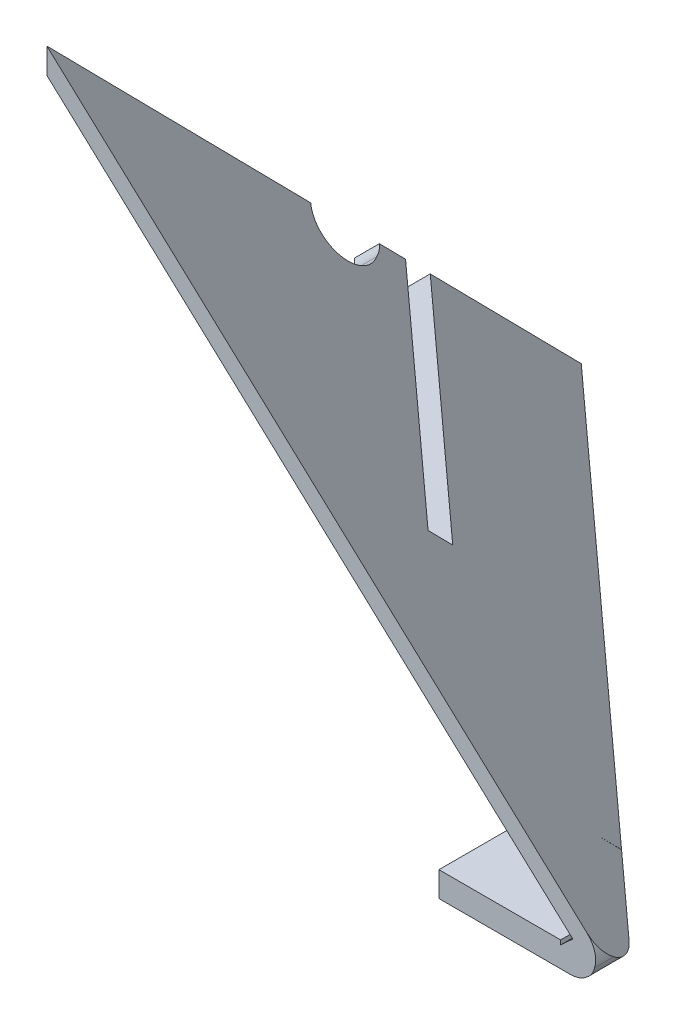
ISO-10303-21;
HEADER;
FILE_DESCRIPTION(('STEP AP214'),'2;1');
FILE_NAME('part.step','',(''),(''),'','','');
FILE_SCHEMA(('AUTOMOTIVE_DESIGN { 1 0 10303 214 1 1 1 1 }'));
ENDSEC;
DATA;
#1=APPLICATION_CONTEXT('core data for automotive mechanical design processes');
#2=APPLICATION_PROTOCOL_DEFINITION('international standard','automotive_design',2000,#1);
#3=PRODUCT_CONTEXT('',#1,'mechanical');
#4=PRODUCT('Part','Part','',(#3));
#5=PRODUCT_RELATED_PRODUCT_CATEGORY('part','',(#4));
#6=PRODUCT_DEFINITION_FORMATION('','',#4);
#7=PRODUCT_DEFINITION_CONTEXT('part definition',#1,'design');
#8=PRODUCT_DEFINITION('design','',#6,#7);
#9=PRODUCT_DEFINITION_SHAPE('','',#8);
#10=(LENGTH_UNIT() NAMED_UNIT(*) SI_UNIT(.MILLI.,.METRE.));
#11=(NAMED_UNIT(*) PLANE_ANGLE_UNIT() SI_UNIT($,.RADIAN.));
#12=(NAMED_UNIT(*) SI_UNIT($,.STERADIAN.) SOLID_ANGLE_UNIT());
#13=UNCERTAINTY_MEASURE_WITH_UNIT(LENGTH_MEASURE(1.E-05),#10,'distance_accuracy_value','');
#14=(GEOMETRIC_REPRESENTATION_CONTEXT(3) GLOBAL_UNCERTAINTY_ASSIGNED_CONTEXT((#13)) GLOBAL_UNIT_ASSIGNED_CONTEXT((#10,
#11,#12)) REPRESENTATION_CONTEXT('',''));
#15=CARTESIAN_POINT('',(0.,0.,0.));
#16=DIRECTION('',(0.,0.,1.));
#17=DIRECTION('',(1.,0.,0.));
#18=AXIS2_PLACEMENT_3D('',#15,#16,#17);
#19=CARTESIAN_POINT('',(-6.31999999999999,22.8853755359338,-18.87));
#20=DIRECTION('',(1.,0.,0.));
#21=DIRECTION('',(0.,-1.,0.));
#22=AXIS2_PLACEMENT_3D('',#19,#20,#21);
#23=PLANE('',#22);
#24=DIRECTION('',(0.,0.,-1.));
#25=VECTOR('',#24,1.);
#26=CARTESIAN_POINT('',(-6.31999999999994,19.8853755359338,-18.87));
#27=LINE('',#26,#25);
#28=CARTESIAN_POINT('',(-6.32000000000005,19.8853755359338,0.));
#29=VERTEX_POINT('',#28);
#30=CARTESIAN_POINT('',(-6.31999999999995,19.8853755359338,-18.352189818249));
#31=VERTEX_POINT('',#30);
#32=EDGE_CURVE('E1924',#29,#31,#27,.T.);
#33=ORIENTED_EDGE('',*,*,#32,.F.);
#34=DIRECTION('',(0.,-1.,0.));
#35=VECTOR('',#34,1.);
#36=CARTESIAN_POINT('',(-6.31999999999999,22.8853755359338,0.));
#37=LINE('',#36,#35);
#38=CARTESIAN_POINT('',(-6.31999999999998,22.8853755359338,0.));
#39=VERTEX_POINT('',#38);
#40=EDGE_CURVE('E1922',#39,#29,#37,.T.);
#41=ORIENTED_EDGE('',*,*,#40,.F.);
#42=DIRECTION('',(0.,0.,1.));
#43=VECTOR('',#42,1.);
#44=CARTESIAN_POINT('',(-6.31999999999999,22.8853755359338,-18.87));
#45=LINE('',#44,#43);
#46=CARTESIAN_POINT('',(-6.31999999999998,22.8853755359338,-15.3957327664914));
#47=VERTEX_POINT('',#46);
#48=EDGE_CURVE('E1883',#47,#39,#45,.T.);
#49=ORIENTED_EDGE('',*,*,#48,.F.);
#50=DIRECTION('',(0.,0.712256848864686,0.701918927829524));
#51=VECTOR('',#50,1.);
#52=CARTESIAN_POINT('',(-6.31999999999867,-47.9024161669893,-85.156088085974));
#53=LINE('',#52,#51);
#54=EDGE_CURVE('E1886',#31,#47,#53,.T.);
#55=ORIENTED_EDGE('',*,*,#54,.F.);
#56=EDGE_LOOP('',(#33,#41,#49,#55));
#57=FACE_BOUND('',#56,.T.);
#58=ADVANCED_FACE('F1643',(#57),#23,.F.);
#59=CARTESIAN_POINT('',(-6.31999999999999,22.8853755359338,-18.87));
#60=DIRECTION('',(0.,1.,0.));
#61=DIRECTION('',(0.,0.,1.));
#62=AXIS2_PLACEMENT_3D('',#59,#60,#61);
#63=PLANE('',#62);
#64=ORIENTED_EDGE('',*,*,#48,.T.);
#65=DIRECTION('',(1.,0.,0.));
#66=VECTOR('',#65,1.);
#67=CARTESIAN_POINT('',(-6.31999999999999,22.8853755359338,0.));
#68=LINE('',#67,#66);
#69=CARTESIAN_POINT('',(8.26000000000006,22.8853755359338,0.));
#70=VERTEX_POINT('',#69);
#71=EDGE_CURVE('E1919',#39,#70,#68,.T.);
#72=ORIENTED_EDGE('',*,*,#71,.T.);
#73=DIRECTION('',(0.,0.,-1.));
#74=VECTOR('',#73,1.);
#75=CARTESIAN_POINT('',(8.26000000000006,22.8853755359338,-12.669921300332));
#76=LINE('',#75,#74);
#77=CARTESIAN_POINT('',(8.26000000000006,22.8853755359338,-2.14828904095654));
#78=VERTEX_POINT('',#77);
#79=EDGE_CURVE('E1974',#70,#78,#76,.T.);
#80=ORIENTED_EDGE('',*,*,#79,.T.);
#81=DIRECTION('',(-0.74011948275692,0.,-0.672475390808935));
#82=VECTOR('',#81,1.);
#83=CARTESIAN_POINT('',(-73.1281881226027,22.8853755359338,-76.0979078391338));
#84=LINE('',#83,#82);
#85=EDGE_CURVE('E1889',#78,#47,#84,.T.);
#86=ORIENTED_EDGE('',*,*,#85,.T.);
#87=EDGE_LOOP('',(#64,#72,#80,#86));
#88=FACE_BOUND('',#87,.T.);
#89=ADVANCED_FACE('F1856',(#88),#63,.T.);
#90=CARTESIAN_POINT('',(-53.32,48.6758787338886,-108.58));
#91=DIRECTION('',(0.,0.,1.));
#92=DIRECTION('',(1.,0.,0.));
#93=AXIS2_PLACEMENT_3D('',#90,#91,#92);
#94=CYLINDRICAL_SURFACE('',#93,4.11454134071264);
#95=DIRECTION('',(0.,0.,1.));
#96=VECTOR('',#95,1.);
#97=CARTESIAN_POINT('',(-53.32,52.7904200746012,-108.58));
#98=LINE('',#97,#96);
#99=CARTESIAN_POINT('',(-53.32,52.7904200746012,-31.629119133167));
#100=VERTEX_POINT('',#99);
#101=CARTESIAN_POINT('',(-53.32,52.7904200746013,-28.629119133167));
#102=VERTEX_POINT('',#101);
#103=EDGE_CURVE('E1910',#100,#102,#98,.T.);
#104=ORIENTED_EDGE('',*,*,#103,.F.);
#105=CARTESIAN_POINT('',(-53.32,48.6758787338886,-35.683940720333));
#106=DIRECTION('',(0.543310732637366,0.589283179245144,-0.597962191496908));
#107=DIRECTION('',(0.405326791463705,0.439623673818327,0.801524308764379));
#108=AXIS2_PLACEMENT_3D('',#105,#106,#107);
#109=ELLIPSE('',#108,6.88093896106124,4.11454134071264);
#110=CARTESIAN_POINT('',(-51.6446774539764,44.9178546771244,-37.8652151596091));
#111=VERTEX_POINT('',#110);
#112=EDGE_CURVE('E1808',#111,#100,#109,.F.);
#113=ORIENTED_EDGE('',*,*,#112,.F.);
#114=DIRECTION('',(0.,0.,1.));
#115=VECTOR('',#114,1.);
#116=CARTESIAN_POINT('',(-51.6446774539764,44.9178546771244,-344.));
#117=LINE('',#116,#115);
#118=CARTESIAN_POINT('',(-51.6446774539764,44.9178546771244,-34.8652151596091));
#119=VERTEX_POINT('',#118);
#120=EDGE_CURVE('E1993',#119,#111,#117,.F.);
#121=ORIENTED_EDGE('',*,*,#120,.F.);
#122=CARTESIAN_POINT('',(-53.32,48.6758787338886,-32.683940720333));
#123=DIRECTION('',(-0.543310732637366,-0.589283179245143,0.597962191496908));
#124=DIRECTION('',(0.405326791463705,0.439623673818327,0.801524308764379));
#125=AXIS2_PLACEMENT_3D('',#122,#123,#124);
#126=ELLIPSE('',#125,6.88093896106124,4.11454134071264);
#127=EDGE_CURVE('E1955',#102,#119,#126,.F.);
#128=ORIENTED_EDGE('',*,*,#127,.F.);
#129=EDGE_LOOP('',(#104,#113,#121,#128));
#130=FACE_BOUND('',#129,.T.);
#131=ADVANCED_FACE('F2019',(#130),#94,.F.);
#132=CARTESIAN_POINT('',(-3.32,19.8853755359338,-175.));
#133=DIRECTION('',(0.,1.,0.));
#134=DIRECTION('',(0.,0.,1.));
#135=AXIS2_PLACEMENT_3D('',#132,#133,#134);
#136=PLANE('',#135);
#137=DIRECTION('',(-0.74011948275692,0.,-0.672475390808935));
#138=VECTOR('',#137,1.);
#139=CARTESIAN_POINT('',(-71.6567235612484,19.8853755359338,-77.7173865664291));
#140=LINE('',#139,#138);
#141=CARTESIAN_POINT('',(-53.32,19.8853755359338,-61.0565694547469));
#142=VERTEX_POINT('',#141);
#143=EDGE_CURVE('E1817',#31,#142,#140,.T.);
#144=ORIENTED_EDGE('',*,*,#143,.T.);
#145=DIRECTION('',(0.,0.,-1.));
#146=VECTOR('',#145,1.);
#147=CARTESIAN_POINT('',(-53.32,19.8853755359338,-175.));
#148=LINE('',#147,#146);
#149=CARTESIAN_POINT('',(-53.32,19.8853755359338,-64.0565694547469));
#150=VERTEX_POINT('',#149);
#151=EDGE_CURVE('E1908',#142,#150,#148,.T.);
#152=ORIENTED_EDGE('',*,*,#151,.T.);
#153=DIRECTION('',(-0.740119482756919,0.,-0.672475390808936));
#154=VECTOR('',#153,1.);
#155=CARTESIAN_POINT('',(-4.81999999999995,19.8853755359338,-19.9892840851692));
#156=LINE('',#155,#154);
#157=CARTESIAN_POINT('',(-0.467862805480057,19.8853755359338,-16.0349155961288));
#158=VERTEX_POINT('',#157);
#159=EDGE_CURVE('E1881',#158,#150,#156,.T.);
#160=ORIENTED_EDGE('',*,*,#159,.F.);
#161=DIRECTION('',(-1.,0.,0.));
#162=VECTOR('',#161,1.);
#163=CARTESIAN_POINT('',(7.68000000000017,19.8853755359338,-16.0349155961288));
#164=LINE('',#163,#162);
#165=CARTESIAN_POINT('',(-0.440104410057803,19.8853755359338,-16.0349155961288));
#166=VERTEX_POINT('',#165);
#167=EDGE_CURVE('E1933',#166,#158,#164,.T.);
#168=ORIENTED_EDGE('',*,*,#167,.F.);
#169=DIRECTION('',(0.,0.,-1.));
#170=VECTOR('',#169,1.);
#171=CARTESIAN_POINT('',(-0.44010441005781,19.8853755359338,-19.7112838552661));
#172=LINE('',#171,#170);
#173=CARTESIAN_POINT('',(-0.440104410057809,19.8853755359338,-16.0096942119541));
#174=VERTEX_POINT('',#173);
#175=EDGE_CURVE('E1926',#174,#166,#172,.T.);
#176=ORIENTED_EDGE('',*,*,#175,.F.);
#177=DIRECTION('',(0.74011948275692,0.,0.672475390808935));
#178=VECTOR('',#177,1.);
#179=CARTESIAN_POINT('',(14.0017304124732,19.8853755359338,-2.88778789474223));
#180=LINE('',#179,#178);
#181=CARTESIAN_POINT('',(9.5003754069526,19.8853755359338,-6.9777362571763));
#182=VERTEX_POINT('',#181);
#183=EDGE_CURVE('E1821',#174,#182,#180,.T.);
#184=ORIENTED_EDGE('',*,*,#183,.T.);
#185=DIRECTION('',(0.,0.,1.));
#186=VECTOR('',#185,1.);
#187=CARTESIAN_POINT('',(9.5003754069526,19.8853755359338,-11.58));
#188=LINE('',#187,#186);
#189=CARTESIAN_POINT('',(9.5003754069526,19.8853755359338,0.));
#190=VERTEX_POINT('',#189);
#191=EDGE_CURVE('E1878',#182,#190,#188,.T.);
#192=ORIENTED_EDGE('',*,*,#191,.T.);
#193=DIRECTION('',(1.,0.,0.));
#194=VECTOR('',#193,1.);
#195=CARTESIAN_POINT('',(-272.32,19.8853755359338,0.));
#196=LINE('',#195,#194);
#197=EDGE_CURVE('E1917',#29,#190,#196,.T.);
#198=ORIENTED_EDGE('',*,*,#197,.F.);
#199=ORIENTED_EDGE('',*,*,#32,.T.);
#200=EDGE_LOOP('',(#144,#152,#160,#168,#176,#184,#192,#198,#199));
#201=FACE_BOUND('',#200,.T.);
#202=ADVANCED_FACE('F1645',(#201),#136,.F.);
#203=CARTESIAN_POINT('',(-82.82,38.2527400163248,-65.58));
#204=DIRECTION('',(0.,1.,0.));
#205=DIRECTION('',(0.,0.,1.));
#206=AXIS2_PLACEMENT_3D('',#203,#204,#205);
#207=PLANE('',#206);
#208=DIRECTION('',(0.,0.,-1.));
#209=VECTOR('',#208,1.);
#210=CARTESIAN_POINT('',(-53.32,38.2527400163248,-65.58));
#211=LINE('',#210,#209);
#212=CARTESIAN_POINT('',(-53.32,38.2527400163247,-42.9557947079959));
#213=VERTEX_POINT('',#212);
#214=CARTESIAN_POINT('',(-53.32,38.2527400163248,-45.9557947079958));
#215=VERTEX_POINT('',#214);
#216=EDGE_CURVE('E1912',#213,#215,#211,.T.);
#217=ORIENTED_EDGE('',*,*,#216,.F.);
#218=DIRECTION('',(-0.74011948275692,0.,-0.672475390808935));
#219=VECTOR('',#218,1.);
#220=CARTESIAN_POINT('',(-80.6656988673726,38.2527400163247,-67.802201215605));
#221=LINE('',#220,#219);
#222=CARTESIAN_POINT('',(-23.82,38.2527400163247,-16.1519819574281));
#223=VERTEX_POINT('',#222);
#224=EDGE_CURVE('E1966',#223,#213,#221,.T.);
#225=ORIENTED_EDGE('',*,*,#224,.F.);
#226=DIRECTION('',(0.,0.,1.));
#227=VECTOR('',#226,1.);
#228=CARTESIAN_POINT('',(-23.82,38.2527400163248,-65.58));
#229=LINE('',#228,#227);
#230=CARTESIAN_POINT('',(-23.82,38.2527400163247,-19.151981957428));
#231=VERTEX_POINT('',#230);
#232=EDGE_CURVE('E1960',#231,#223,#229,.T.);
#233=ORIENTED_EDGE('',*,*,#232,.F.);
#234=DIRECTION('',(0.74011948275692,0.,0.672475390808935));
#235=VECTOR('',#234,1.);
#236=CARTESIAN_POINT('',(4.99275510634899,38.2527400163248,7.02739745608192));
#237=LINE('',#236,#235);
#238=EDGE_CURVE('E1968',#215,#231,#237,.T.);
#239=ORIENTED_EDGE('',*,*,#238,.F.);
#240=EDGE_LOOP('',(#217,#225,#233,#239));
#241=FACE_BOUND('',#240,.T.);
#242=ADVANCED_FACE('F2033',(#241),#207,.T.);
#243=CARTESIAN_POINT('',(-23.82,41.2527400163248,-65.58));
#244=DIRECTION('',(0.,-1.,0.));
#245=DIRECTION('',(1.,0.,0.));
#246=AXIS2_PLACEMENT_3D('',#243,#244,#245);
#247=PLANE('',#246);
#248=DIRECTION('',(0.,0.,1.));
#249=VECTOR('',#248,1.);
#250=CARTESIAN_POINT('',(-53.32,41.2527400163248,-65.58));
#251=LINE('',#250,#249);
#252=CARTESIAN_POINT('',(-53.32,41.2527400163248,-42.9993376562383));
#253=VERTEX_POINT('',#252);
#254=CARTESIAN_POINT('',(-53.32,41.2527400163247,-39.9993376562383));
#255=VERTEX_POINT('',#254);
#256=EDGE_CURVE('E1658',#253,#255,#251,.T.);
#257=ORIENTED_EDGE('',*,*,#256,.F.);
#258=DIRECTION('',(-0.74011948275692,0.,-0.672475390808935));
#259=VECTOR('',#258,1.);
#260=CARTESIAN_POINT('',(3.52129054499471,41.2527400163247,8.64687618337722));
#261=LINE('',#260,#259);
#262=CARTESIAN_POINT('',(-23.82,41.2527400163248,-16.1955249056705));
#263=VERTEX_POINT('',#262);
#264=EDGE_CURVE('E1963',#263,#253,#261,.T.);
#265=ORIENTED_EDGE('',*,*,#264,.F.);
#266=DIRECTION('',(0.,0.,1.));
#267=VECTOR('',#266,1.);
#268=CARTESIAN_POINT('',(-23.82,41.2527400163248,-65.58));
#269=LINE('',#268,#267);
#270=CARTESIAN_POINT('',(-23.82,41.2527400163247,-13.1955249056705));
#271=VERTEX_POINT('',#270);
#272=EDGE_CURVE('E1958',#263,#271,#269,.T.);
#273=ORIENTED_EDGE('',*,*,#272,.T.);
#274=DIRECTION('',(0.74011948275692,0.,0.672475390808935));
#275=VECTOR('',#274,1.);
#276=CARTESIAN_POINT('',(-82.1371634287268,41.2527400163248,-66.1827224883097));
#277=LINE('',#276,#275);
#278=EDGE_CURVE('E1899',#255,#271,#277,.T.);
#279=ORIENTED_EDGE('',*,*,#278,.F.);
#280=EDGE_LOOP('',(#257,#265,#273,#279));
#281=FACE_BOUND('',#280,.T.);
#282=ADVANCED_FACE('F2028',(#281),#247,.T.);
#283=CARTESIAN_POINT('',(-53.32,47.5929050483899,-688.));
#284=DIRECTION('',(0.,0.,1.));
#285=DIRECTION('',(1.,0.,0.));
#286=AXIS2_PLACEMENT_3D('',#283,#284,#285);
#287=CYLINDRICAL_SURFACE('',#286,3.15635868082551);
#288=DIRECTION('',(0.,0.,1.));
#289=VECTOR('',#288,1.);
#290=CARTESIAN_POINT('',(-53.32,44.4365463675644,-688.));
#291=LINE('',#290,#289);
#292=CARTESIAN_POINT('',(-53.32,44.4365463675644,-36.8617420767207));
#293=VERTEX_POINT('',#292);
#294=CARTESIAN_POINT('',(-53.32,44.4365463675644,-39.8617420767207));
#295=VERTEX_POINT('',#294);
#296=EDGE_CURVE('E1904',#293,#295,#291,.F.);
#297=ORIENTED_EDGE('',*,*,#296,.F.);
#298=CARTESIAN_POINT('',(-53.32,47.5929050483899,-33.7511957834531));
#299=DIRECTION('',(-0.543310732637366,-0.589283179245143,0.597962191496908));
#300=DIRECTION('',(0.405326791463705,0.439623673818327,0.801524308764379));
#301=AXIS2_PLACEMENT_3D('',#298,#299,#300);
#302=ELLIPSE('',#301,5.27852550831692,3.15635868082551);
#303=EDGE_CURVE('E1901',#119,#293,#302,.F.);
#304=ORIENTED_EDGE('',*,*,#303,.F.);
#305=ORIENTED_EDGE('',*,*,#120,.T.);
#306=CARTESIAN_POINT('',(-53.32,47.5929050483899,-36.7511957834532));
#307=DIRECTION('',(0.543310732637366,0.589283179245144,-0.597962191496908));
#308=DIRECTION('',(0.405326791463705,0.439623673818327,0.801524308764379));
#309=AXIS2_PLACEMENT_3D('',#306,#307,#308);
#310=ELLIPSE('',#309,5.27852550831692,3.15635868082551);
#311=EDGE_CURVE('E1666',#295,#111,#310,.F.);
#312=ORIENTED_EDGE('',*,*,#311,.F.);
#313=EDGE_LOOP('',(#297,#304,#305,#312));
#314=FACE_BOUND('',#313,.T.);
#315=ADVANCED_FACE('F1906',(#314),#287,.F.);
#316=CARTESIAN_POINT('',(11.3778752940316,25.2348522151955,0.));
#317=DIRECTION('',(-0.543310732637366,-0.589283179245144,0.597962191496908));
#318=DIRECTION('',(0.,-0.712256848864679,-0.70191892782953));
#319=AXIS2_PLACEMENT_3D('',#316,#317,#318);
#320=PLANE('',#319);
#321=DIRECTION('',(0.,-0.712256848864678,-0.701918927829531));
#322=VECTOR('',#321,1.);
#323=CARTESIAN_POINT('',(-0.440104410057809,21.3853755359338,-14.5314656860753));
#324=LINE('',#323,#322);
#325=CARTESIAN_POINT('',(-0.44010441005781,22.8853755359338,-13.0532371601965));
#326=VERTEX_POINT('',#325);
#327=EDGE_CURVE('E1927',#326,#174,#324,.T.);
#328=ORIENTED_EDGE('',*,*,#327,.F.);
#329=DIRECTION('',(-0.00656258443387309,-0.709254011340941,-0.704922463737915));
#330=VECTOR('',#329,1.);
#331=CARTESIAN_POINT('',(-0.36827395485918,30.6484815194707,-5.33754192454026));
#332=LINE('',#331,#330);
#333=EDGE_CURVE('E1989',#326,#158,#332,.T.);
#334=ORIENTED_EDGE('',*,*,#333,.T.);
#335=ORIENTED_EDGE('',*,*,#159,.T.);
#336=DIRECTION('',(0.,0.712256848864679,0.70191892782953));
#337=VECTOR('',#336,1.);
#338=CARTESIAN_POINT('',(-53.32,54.6240793614704,-29.8220741567719));
#339=LINE('',#338,#337);
#340=EDGE_CURVE('E1811',#150,#215,#339,.T.);
#341=ORIENTED_EDGE('',*,*,#340,.T.);
#342=ORIENTED_EDGE('',*,*,#238,.T.);
#343=DIRECTION('',(0.,0.712256848864681,0.701918927829529));
#344=VECTOR('',#343,1.);
#345=CARTESIAN_POINT('',(-23.82,41.2236052829175,-16.2242367683481));
#346=LINE('',#345,#344);
#347=EDGE_CURVE('E1970',#231,#263,#346,.T.);
#348=ORIENTED_EDGE('',*,*,#347,.T.);
#349=ORIENTED_EDGE('',*,*,#264,.T.);
#350=EDGE_CURVE('E1809',#253,#295,#339,.T.);
#351=ORIENTED_EDGE('',*,*,#350,.T.);
#352=ORIENTED_EDGE('',*,*,#311,.T.);
#353=ORIENTED_EDGE('',*,*,#112,.T.);
#354=CARTESIAN_POINT('',(-53.32,84.8853755359338,0.));
#355=VERTEX_POINT('',#354);
#356=EDGE_CURVE('E1789',#100,#355,#339,.T.);
#357=ORIENTED_EDGE('',*,*,#356,.T.);
#358=DIRECTION('',(0.735203128341268,-0.67784685591748,0.));
#359=VECTOR('',#358,1.);
#360=CARTESIAN_POINT('',(-53.32,84.8853755359338,0.));
#361=LINE('',#360,#359);
#362=CARTESIAN_POINT('',(11.3778752940316,25.2348522151955,0.));
#363=VERTEX_POINT('',#362);
#364=EDGE_CURVE('E1796',#355,#363,#361,.T.);
#365=ORIENTED_EDGE('',*,*,#364,.T.);
#366=DIRECTION('',(0.670805913335649,-0.732995321926294,-0.112859579425472));
#367=VECTOR('',#366,1.);
#368=CARTESIAN_POINT('',(12.2106508998386,24.3248712339077,-0.140110131349057));
#369=LINE('',#368,#367);
#370=CARTESIAN_POINT('',(11.6744949529342,24.9107333932761,-0.0499047031154194));
#371=VERTEX_POINT('',#370);
#372=EDGE_CURVE('E1988',#363,#371,#369,.T.);
#373=ORIENTED_EDGE('',*,*,#372,.T.);
#374=CARTESIAN_POINT('',(9.46136921097961,22.8853755359338,-4.05672038416357));
#375=DIRECTION('',(-0.543310732637367,-0.589283179245143,0.597962191496908));
#376=DIRECTION('',(0.405326791463706,0.439623673818326,0.801524308764379));
#377=AXIS2_PLACEMENT_3D('',#374,#375,#376);
#378=ELLIPSE('',#377,5.01703960996255,3.);
#379=CARTESIAN_POINT('',(12.3340327593739,22.020618843143,-2.29881264543837));
#380=VERTEX_POINT('',#379);
#381=EDGE_CURVE('E1936',#371,#380,#378,.F.);
#382=ORIENTED_EDGE('',*,*,#381,.T.);
#383=CARTESIAN_POINT('',(9.50037540695259,19.8853755359338,-6.97773625717631));
#384=CARTESIAN_POINT('',(9.64734229147146,19.9029260406261,-6.82690581306735));
#385=CARTESIAN_POINT('',(9.79093334614256,19.9261744818644,-6.67352742596683));
#386=CARTESIAN_POINT('',(10.0706070994457,19.9843797270915,-6.36205434888731));
#387=CARTESIAN_POINT('',(10.2066852782625,20.0193434916204,-6.20395690611717));
#388=CARTESIAN_POINT('',(10.6037277927317,20.1426927775242,-5.721643604573));
#389=CARTESIAN_POINT('',(10.8518402410643,20.2493478032925,-5.39110068470631));
#390=CARTESIAN_POINT('',(11.2908203387049,20.5044420278325,-4.74084998385017));
#391=CARTESIAN_POINT('',(11.4842637883822,20.6499210756966,-4.42171900714208));
#392=CARTESIAN_POINT('',(11.8241725019775,20.9853791673883,-3.78228750390315));
#393=CARTESIAN_POINT('',(11.9707488661477,21.1752510965239,-3.46199159125425));
#394=CARTESIAN_POINT('',(12.1796910910171,21.5511632711151,-2.90168982067897));
#395=CARTESIAN_POINT('',(12.2536289825831,21.7282463541396,-2.6599967266227));
#396=CARTESIAN_POINT('',(12.3610585261118,22.1081826919942,-2.18796401101466));
#397=CARTESIAN_POINT('',(12.394591703821,22.3110092516381,-1.95761296673482));
#398=CARTESIAN_POINT('',(12.4121036836758,22.6962067340537,-1.56209491050473));
#399=CARTESIAN_POINT('',(12.4048017863978,22.874299828371,-1.39322124742524));
#400=CARTESIAN_POINT('',(12.3687195504628,23.1502553211819,-1.15405551733995));
#401=CARTESIAN_POINT('',(12.3524968143751,23.2437339012731,-1.07667375492048));
#402=CARTESIAN_POINT('',(12.3113425511761,23.4331209533727,-0.927428447193074));
#403=CARTESIAN_POINT('',(12.2864149592551,23.5290283092682,-0.855562426269483));
#404=CARTESIAN_POINT('',(12.227362256211,23.7235089037698,-0.717560096276516));
#405=CARTESIAN_POINT('',(12.193157008956,23.8220982995114,-0.651480676577075));
#406=CARTESIAN_POINT('',(12.1156152017405,24.0202585833861,-0.526651336102121));
#407=CARTESIAN_POINT('',(12.0722834181525,24.119828932256,-0.467897606932363));
#408=CARTESIAN_POINT('',(11.9766840394417,24.3189943379208,-0.358484911800359));
#409=CARTESIAN_POINT('',(11.924424581608,24.4185892904656,-0.30781865500302));
#410=CARTESIAN_POINT('',(11.8113665932192,24.6168800291436,-0.215130891145718));
#411=CARTESIAN_POINT('',(11.7505729827439,24.7155762987152,-0.17310443726101));
#412=CARTESIAN_POINT('',(11.6384728334109,24.8848650524312,-0.108127418161965));
#413=CARTESIAN_POINT('',(11.5890039514045,24.9558858150459,-0.0830850886079355));
#414=CARTESIAN_POINT('',(11.486243307052,25.0964898557966,-0.0378905335622563));
#415=CARTESIAN_POINT('',(11.4329589109455,25.1660755866669,-0.0177291979427022));
#416=CARTESIAN_POINT('',(11.3778752940316,25.2348522151955,0.));
#417=B_SPLINE_CURVE_WITH_KNOTS('',3,(#383,#384,#385,#386,#387,#388,#389,#390,#391,#392,#393,
#394,#395,#396,#397,#398,#399,#400,#401,#402,#403,#404,#405,#406,#407,#408,#409,#410,#411,#412,
#413,#414,#415,#416),.UNSPECIFIED.,.F.,.F.,(4,2,2,2,2,2,2,2,2,2,2,2,2,2,2,2,4),(0.,
0.633716048981469,1.26780928351421,2.54306962577711,3.74020289728162,4.93447690858042,
5.85702738026434,6.77862889427843,7.51207660581853,7.87898121898074,8.24572018042855,
8.61573370739606,8.98555406684668,9.35503912800027,9.72431204312145,9.99440031072621,
10.2639805171849),.UNSPECIFIED.);
#418=CARTESIAN_POINT('',(11.4052383006179,20.6003431592816,-4.54238019422978));
#419=VERTEX_POINT('',#418);
#420=EDGE_CURVE('E1802',#419,#380,#417,.T.);
#421=ORIENTED_EDGE('',*,*,#420,.F.);
#422=CARTESIAN_POINT('',(9.50276330850904,19.8856611280793,-6.97528515372457));
#423=VERTEX_POINT('',#422);
#424=EDGE_CURVE('E1939',#419,#423,#378,.F.);
#425=ORIENTED_EDGE('',*,*,#424,.T.);
#426=EDGE_CURVE('E1833',#182,#423,#417,.T.);
#427=ORIENTED_EDGE('',*,*,#426,.F.);
#428=ORIENTED_EDGE('',*,*,#183,.F.);
#429=EDGE_LOOP('',(#328,#334,#335,#341,#342,#348,#349,#351,#352,#353,#357,#365,#373,#382,#421,
#425,#427,#428));
#430=FACE_BOUND('',#429,.T.);
#431=ADVANCED_FACE('F1806',(#430),#320,.F.);
#432=CARTESIAN_POINT('',(9.46136921097961,22.8853755359338,-11.0000000000001));
#433=DIRECTION('',(0.,0.,1.));
#434=DIRECTION('',(-1.,0.,0.));
#435=AXIS2_PLACEMENT_3D('',#432,#433,#434);
#436=CYLINDRICAL_SURFACE('',#435,3.);
#437=DIRECTION('',(0.,0.,1.));
#438=VECTOR('',#437,1.);
#439=CARTESIAN_POINT('',(11.6744949529342,24.9107333932761,-11.0000000000001));
#440=LINE('',#439,#438);
#441=CARTESIAN_POINT('',(11.6744949529342,24.9107333932761,0.));
#442=VERTEX_POINT('',#441);
#443=EDGE_CURVE('E1945',#371,#442,#440,.T.);
#444=ORIENTED_EDGE('',*,*,#443,.T.);
#445=CARTESIAN_POINT('',(9.46136921097961,22.8853755359338,0.));
#446=DIRECTION('',(0.,0.,-1.));
#447=DIRECTION('',(-1.,0.,0.));
#448=AXIS2_PLACEMENT_3D('',#445,#446,#447);
#449=CIRCLE('',#448,3.);
#450=CARTESIAN_POINT('',(12.3340327593739,22.020618843143,0.));
#451=VERTEX_POINT('',#450);
#452=EDGE_CURVE('E1942',#442,#451,#449,.T.);
#453=ORIENTED_EDGE('',*,*,#452,.T.);
#454=DIRECTION('',(0.,0.,1.));
#455=VECTOR('',#454,1.);
#456=CARTESIAN_POINT('',(12.3340327593739,22.020618843143,-3.50980133735969));
#457=LINE('',#456,#455);
#458=EDGE_CURVE('E1948',#451,#380,#457,.F.);
#459=ORIENTED_EDGE('',*,*,#458,.T.);
#460=ORIENTED_EDGE('',*,*,#381,.F.);
#461=EDGE_LOOP('',(#444,#453,#459,#460));
#462=FACE_BOUND('',#461,.T.);
#463=ADVANCED_FACE('F1985',(#462),#436,.T.);
#464=DIRECTION('',(0.,0.,1.));
#465=VECTOR('',#464,1.);
#466=CARTESIAN_POINT('',(11.4052383006179,20.6003431592816,-3.50980133735969));
#467=LINE('',#466,#465);
#468=CARTESIAN_POINT('',(11.4052383006179,20.6003431592816,0.));
#469=VERTEX_POINT('',#468);
#470=EDGE_CURVE('E1950',#419,#469,#467,.T.);
#471=ORIENTED_EDGE('',*,*,#470,.T.);
#472=CARTESIAN_POINT('',(9.50276330850872,19.8856611280793,0.));
#473=VERTEX_POINT('',#472);
#474=EDGE_CURVE('E1941',#469,#473,#449,.T.);
#475=ORIENTED_EDGE('',*,*,#474,.T.);
#476=DIRECTION('',(0.,0.,1.));
#477=VECTOR('',#476,1.);
#478=CARTESIAN_POINT('',(9.50276330850904,19.8856611280793,-3.50980133735969));
#479=LINE('',#478,#477);
#480=EDGE_CURVE('E1953',#473,#423,#479,.F.);
#481=ORIENTED_EDGE('',*,*,#480,.T.);
#482=ORIENTED_EDGE('',*,*,#424,.F.);
#483=EDGE_LOOP('',(#471,#475,#481,#482));
#484=FACE_BOUND('',#483,.T.);
#485=ADVANCED_FACE('F2057',(#484),#436,.T.);
#486=CARTESIAN_POINT('',(11.3778752940316,25.2348522151955,-11.0000000000001));
#487=DIRECTION('',(0.737708580651539,0.675119285780736,0.));
#488=DIRECTION('',(0.675119285780736,-0.737708580651539,0.));
#489=AXIS2_PLACEMENT_3D('',#486,#487,#488);
#490=PLANE('',#489);
#491=DIRECTION('',(0.675119285780736,-0.737708580651539,0.));
#492=VECTOR('',#491,1.);
#493=CARTESIAN_POINT('',(11.3778752940316,25.2348522151955,0.));
#494=LINE('',#493,#492);
#495=EDGE_CURVE('E1799',#363,#442,#494,.T.);
#496=ORIENTED_EDGE('',*,*,#495,.T.);
#497=ORIENTED_EDGE('',*,*,#443,.F.);
#498=ORIENTED_EDGE('',*,*,#372,.F.);
#499=EDGE_LOOP('',(#496,#497,#498));
#500=FACE_BOUND('',#499,.T.);
#501=ADVANCED_FACE('F1987',(#500),#490,.T.);
#502=CARTESIAN_POINT('',(9.50037540695259,19.8853755359338,-11.58));
#503=CARTESIAN_POINT('',(12.4886945247822,20.2421043573605,-11.58));
#504=CARTESIAN_POINT('',(13.277682172138,22.8623382503191,-11.58));
#505=CARTESIAN_POINT('',(11.3778752940316,25.2348522151955,-11.58));
#506=B_SPLINE_CURVE_WITH_KNOTS('',3,(#502,#503,#504,#505),.UNSPECIFIED.,.F.,.F.,(4,4),(0.,1.),.UNSPECIFIED.);
#507=DIRECTION('',(0.,0.,1.));
#508=VECTOR('',#507,1.);
#509=SURFACE_OF_LINEAR_EXTRUSION('',#506,#508);
#510=CARTESIAN_POINT('',(9.50037540695259,19.8853755359338,0.));
#511=CARTESIAN_POINT('',(12.4886945247822,20.2421043573605,0.));
#512=CARTESIAN_POINT('',(13.277682172138,22.8623382503191,0.));
#513=CARTESIAN_POINT('',(11.3778752940316,25.2348522151955,0.));
#514=B_SPLINE_CURVE_WITH_KNOTS('',3,(#510,#511,#512,#513),.UNSPECIFIED.,.F.,.F.,(4,4),(0.,1.),.UNSPECIFIED.);
#515=EDGE_CURVE('E1865',#190,#473,#514,.T.);
#516=ORIENTED_EDGE('',*,*,#515,.F.);
#517=ORIENTED_EDGE('',*,*,#191,.F.);
#518=ORIENTED_EDGE('',*,*,#426,.T.);
#519=ORIENTED_EDGE('',*,*,#480,.F.);
#520=EDGE_LOOP('',(#516,#517,#518,#519));
#521=FACE_BOUND('',#520,.T.);
#522=ADVANCED_FACE('F1855',(#521),#509,.T.);
#523=CARTESIAN_POINT('',(-47.606485270918,-29.1478915680913,-104.186830901348));
#524=DIRECTION('',(0.543310732637366,0.589283179245143,-0.597962191496908));
#525=DIRECTION('',(0.,0.712256848864679,0.70191892782953));
#526=AXIS2_PLACEMENT_3D('',#523,#524,#525);
#527=PLANE('',#526);
#528=ORIENTED_EDGE('',*,*,#303,.T.);
#529=DIRECTION('',(0.,-0.712256848864679,-0.70191892782953));
#530=VECTOR('',#529,1.);
#531=CARTESIAN_POINT('',(-53.32,-26.5525083130238,-106.820439179396));
#532=LINE('',#531,#530);
#533=EDGE_CURVE('E1812',#293,#255,#532,.T.);
#534=ORIENTED_EDGE('',*,*,#533,.T.);
#535=ORIENTED_EDGE('',*,*,#278,.T.);
#536=DIRECTION('',(0.,-0.712256848864681,-0.701918927829529));
#537=VECTOR('',#536,1.);
#538=CARTESIAN_POINT('',(-23.8199999999996,-39.9529823915767,-93.2226017909721));
#539=LINE('',#538,#537);
#540=EDGE_CURVE('E1990',#271,#223,#539,.T.);
#541=ORIENTED_EDGE('',*,*,#540,.T.);
#542=ORIENTED_EDGE('',*,*,#224,.T.);
#543=EDGE_CURVE('E1814',#213,#142,#532,.T.);
#544=ORIENTED_EDGE('',*,*,#543,.T.);
#545=ORIENTED_EDGE('',*,*,#143,.F.);
#546=ORIENTED_EDGE('',*,*,#54,.T.);
#547=ORIENTED_EDGE('',*,*,#85,.F.);
#548=DIRECTION('',(0.,-0.712256848864679,-0.70191892782953));
#549=VECTOR('',#548,1.);
#550=CARTESIAN_POINT('',(8.26000000000006,-54.5254301353045,-78.4355298106117));
#551=LINE('',#550,#549);
#552=CARTESIAN_POINT('',(8.26000000000007,22.3602154192799,-2.66582681768418));
#553=VERTEX_POINT('',#552);
#554=EDGE_CURVE('E1863',#78,#553,#551,.T.);
#555=ORIENTED_EDGE('',*,*,#554,.T.);
#556=DIRECTION('',(0.440554221346289,0.406184743085231,0.800578498673772));
#557=VECTOR('',#556,1.);
#558=CARTESIAN_POINT('',(-47.606485270918,-29.1478915680913,-104.186830901348));
#559=LINE('',#558,#557);
#560=CARTESIAN_POINT('',(9.72699075712695,23.7127600889714,0.));
#561=VERTEX_POINT('',#560);
#562=EDGE_CURVE('E1827',#553,#561,#559,.T.);
#563=ORIENTED_EDGE('',*,*,#562,.T.);
#564=DIRECTION('',(-0.735203128341268,0.677846855917481,0.));
#565=VECTOR('',#564,1.);
#566=CARTESIAN_POINT('',(-41.3547430405293,70.8093940868105,0.));
#567=LINE('',#566,#565);
#568=CARTESIAN_POINT('',(-53.32,81.8411912834856,0.));
#569=VERTEX_POINT('',#568);
#570=EDGE_CURVE('E1803',#561,#569,#567,.T.);
#571=ORIENTED_EDGE('',*,*,#570,.T.);
#572=EDGE_CURVE('E1792',#569,#102,#532,.T.);
#573=ORIENTED_EDGE('',*,*,#572,.T.);
#574=ORIENTED_EDGE('',*,*,#127,.T.);
#575=EDGE_LOOP('',(#528,#534,#535,#541,#542,#544,#545,#546,#547,#555,#563,#571,#573,#574));
#576=FACE_BOUND('',#575,.T.);
#577=ADVANCED_FACE('F1897',(#576),#527,.F.);
#578=CARTESIAN_POINT('',(11.3778752940316,25.2348522151955,-11.58));
#579=DIRECTION('',(0.67784685591748,-0.735203128341268,0.));
#580=DIRECTION('',(-0.735203128341269,-0.67784685591748,0.));
#581=AXIS2_PLACEMENT_3D('',#578,#579,#580);
#582=PLANE('',#581);
#583=DIRECTION('',(0.,0.,1.));
#584=VECTOR('',#583,1.);
#585=CARTESIAN_POINT('',(8.26000000000006,22.3602154192799,-11.58));
#586=LINE('',#585,#584);
#587=CARTESIAN_POINT('',(8.26000000000006,22.3602154192799,0.));
#588=VERTEX_POINT('',#587);
#589=EDGE_CURVE('E1842',#553,#588,#586,.T.);
#590=ORIENTED_EDGE('',*,*,#589,.T.);
#591=DIRECTION('',(-0.735203128341269,-0.67784685591748,0.));
#592=VECTOR('',#591,1.);
#593=CARTESIAN_POINT('',(11.3778752940316,25.2348522151955,0.));
#594=LINE('',#593,#592);
#595=EDGE_CURVE('E1872',#561,#588,#594,.T.);
#596=ORIENTED_EDGE('',*,*,#595,.F.);
#597=ORIENTED_EDGE('',*,*,#562,.F.);
#598=EDGE_LOOP('',(#590,#596,#597));
#599=FACE_BOUND('',#598,.T.);
#600=ADVANCED_FACE('F1853',(#599),#582,.F.);
#601=ORIENTED_EDGE('',*,*,#420,.T.);
#602=ORIENTED_EDGE('',*,*,#458,.F.);
#603=EDGE_CURVE('E1873',#469,#451,#514,.T.);
#604=ORIENTED_EDGE('',*,*,#603,.F.);
#605=ORIENTED_EDGE('',*,*,#470,.F.);
#606=EDGE_LOOP('',(#601,#602,#604,#605));
#607=FACE_BOUND('',#606,.T.);
#608=ADVANCED_FACE('F1847',(#607),#509,.T.);
#609=CARTESIAN_POINT('',(8.26000000000006,0.,0.));
#610=DIRECTION('',(-1.,0.,0.));
#611=DIRECTION('',(0.,0.,-1.));
#612=AXIS2_PLACEMENT_3D('',#609,#610,#611);
#613=PLANE('',#612);
#614=ORIENTED_EDGE('',*,*,#79,.F.);
#615=DIRECTION('',(0.,1.,0.));
#616=VECTOR('',#615,1.);
#617=CARTESIAN_POINT('',(8.26000000000006,22.8853755359338,0.));
#618=LINE('',#617,#616);
#619=EDGE_CURVE('E1973',#588,#70,#618,.T.);
#620=ORIENTED_EDGE('',*,*,#619,.F.);
#621=ORIENTED_EDGE('',*,*,#589,.F.);
#622=ORIENTED_EDGE('',*,*,#554,.F.);
#623=EDGE_LOOP('',(#614,#620,#621,#622));
#624=FACE_BOUND('',#623,.T.);
#625=ADVANCED_FACE('F1852',(#624),#613,.F.);
#626=CARTESIAN_POINT('',(-23.82,41.2527400163248,-65.58));
#627=DIRECTION('',(-1.,0.,0.));
#628=DIRECTION('',(0.,1.,0.));
#629=AXIS2_PLACEMENT_3D('',#626,#627,#628);
#630=PLANE('',#629);
#631=ORIENTED_EDGE('',*,*,#347,.F.);
#632=ORIENTED_EDGE('',*,*,#232,.T.);
#633=ORIENTED_EDGE('',*,*,#540,.F.);
#634=ORIENTED_EDGE('',*,*,#272,.F.);
#635=EDGE_LOOP('',(#631,#632,#633,#634));
#636=FACE_BOUND('',#635,.T.);
#637=ADVANCED_FACE('F2012',(#636),#630,.T.);
#638=CARTESIAN_POINT('',(7.68000000000017,19.8853755359338,-16.0349155961288));
#639=DIRECTION('',(0.,-0.704937643857441,0.709269284737975));
#640=DIRECTION('',(0.,-0.709269284737975,-0.704937643857441));
#641=AXIS2_PLACEMENT_3D('',#638,#639,#640);
#642=PLANE('',#641);
#643=ORIENTED_EDGE('',*,*,#333,.F.);
#644=DIRECTION('',(0.,-0.709269284737975,-0.704937643857441));
#645=VECTOR('',#644,1.);
#646=CARTESIAN_POINT('',(-0.440104410057807,19.8853755359338,-16.0349155961288));
#647=LINE('',#646,#645);
#648=EDGE_CURVE('E1651',#326,#166,#647,.T.);
#649=ORIENTED_EDGE('',*,*,#648,.T.);
#650=ORIENTED_EDGE('',*,*,#167,.T.);
#651=EDGE_LOOP('',(#643,#649,#650));
#652=FACE_BOUND('',#651,.T.);
#653=ADVANCED_FACE('F2000',(#652),#642,.F.);
#654=CARTESIAN_POINT('',(-0.44010441005781,22.8853755359338,-16.7422161114212));
#655=DIRECTION('',(-1.,0.,0.));
#656=DIRECTION('',(0.,0.,1.));
#657=AXIS2_PLACEMENT_3D('',#654,#655,#656);
#658=PLANE('',#657);
#659=ORIENTED_EDGE('',*,*,#327,.T.);
#660=ORIENTED_EDGE('',*,*,#175,.T.);
#661=ORIENTED_EDGE('',*,*,#648,.F.);
#662=EDGE_LOOP('',(#659,#660,#661));
#663=FACE_BOUND('',#662,.T.);
#664=ADVANCED_FACE('F2004',(#663),#658,.F.);
#665=CARTESIAN_POINT('',(0.,0.,0.));
#666=DIRECTION('',(0.,0.,1.));
#667=DIRECTION('',(1.,0.,0.));
#668=AXIS2_PLACEMENT_3D('',#665,#666,#667);
#669=PLANE('',#668);
#670=DIRECTION('',(0.,1.,0.));
#671=VECTOR('',#670,1.);
#672=CARTESIAN_POINT('',(-53.32,0.,0.));
#673=LINE('',#672,#671);
#674=EDGE_CURVE('E13',#569,#355,#673,.T.);
#675=ORIENTED_EDGE('',*,*,#674,.F.);
#676=ORIENTED_EDGE('',*,*,#570,.F.);
#677=ORIENTED_EDGE('',*,*,#595,.T.);
#678=ORIENTED_EDGE('',*,*,#619,.T.);
#679=ORIENTED_EDGE('',*,*,#71,.F.);
#680=ORIENTED_EDGE('',*,*,#40,.T.);
#681=ORIENTED_EDGE('',*,*,#197,.T.);
#682=ORIENTED_EDGE('',*,*,#515,.T.);
#683=ORIENTED_EDGE('',*,*,#474,.F.);
#684=ORIENTED_EDGE('',*,*,#603,.T.);
#685=ORIENTED_EDGE('',*,*,#452,.F.);
#686=ORIENTED_EDGE('',*,*,#495,.F.);
#687=ORIENTED_EDGE('',*,*,#364,.F.);
#688=EDGE_LOOP('',(#675,#676,#677,#678,#679,#680,#681,#682,#683,#684,#685,#686,#687));
#689=FACE_BOUND('',#688,.T.);
#690=ADVANCED_FACE('F1797',(#689),#669,.T.);
#691=CARTESIAN_POINT('',(-53.32,19.8853755359338,-169.));
#692=DIRECTION('',(1.,0.,0.));
#693=DIRECTION('',(0.,0.,-1.));
#694=AXIS2_PLACEMENT_3D('',#691,#692,#693);
#695=PLANE('',#694);
#696=ORIENTED_EDGE('',*,*,#103,.T.);
#697=ORIENTED_EDGE('',*,*,#572,.F.);
#698=ORIENTED_EDGE('',*,*,#674,.T.);
#699=ORIENTED_EDGE('',*,*,#356,.F.);
#700=EDGE_LOOP('',(#696,#697,#698,#699));
#701=FACE_BOUND('',#700,.T.);
#702=ADVANCED_FACE('F1787',(#701),#695,.F.);
#703=ORIENTED_EDGE('',*,*,#151,.F.);
#704=ORIENTED_EDGE('',*,*,#543,.F.);
#705=ORIENTED_EDGE('',*,*,#216,.T.);
#706=ORIENTED_EDGE('',*,*,#340,.F.);
#707=EDGE_LOOP('',(#703,#704,#705,#706));
#708=FACE_BOUND('',#707,.T.);
#709=ADVANCED_FACE('F2162',(#708),#695,.F.);
#710=ORIENTED_EDGE('',*,*,#256,.T.);
#711=ORIENTED_EDGE('',*,*,#533,.F.);
#712=ORIENTED_EDGE('',*,*,#296,.T.);
#713=ORIENTED_EDGE('',*,*,#350,.F.);
#714=EDGE_LOOP('',(#710,#711,#712,#713));
#715=FACE_BOUND('',#714,.T.);
#716=ADVANCED_FACE('F1903',(#715),#695,.F.);
#717=CLOSED_SHELL('',(#58,#89,#131,#202,#242,#282,#315,#431,#463,#485,#501,#522,#577,#600,#608,
#625,#637,#653,#664,#690,#702,#709,#716));
#718=MANIFOLD_SOLID_BREP('B2',#717);
#719=ADVANCED_BREP_SHAPE_REPRESENTATION('',(#18,#718),#14);
#720=SHAPE_DEFINITION_REPRESENTATION(#9,#719);
ENDSEC;
END-ISO-10303-21;
